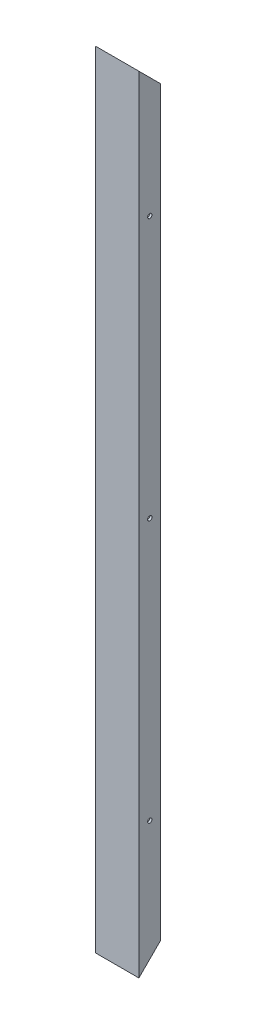
ISO-10303-21;
HEADER;
FILE_DESCRIPTION(('STEP AP214'),'2;1');
FILE_NAME('part.step','',(''),(''),'','','');
FILE_SCHEMA(('AUTOMOTIVE_DESIGN { 1 0 10303 214 1 1 1 1 }'));
ENDSEC;
DATA;
#1=APPLICATION_CONTEXT('core data for automotive mechanical design processes');
#2=APPLICATION_PROTOCOL_DEFINITION('international standard','automotive_design',2000,#1);
#3=PRODUCT_CONTEXT('',#1,'mechanical');
#4=PRODUCT('Part','Part','',(#3));
#5=PRODUCT_RELATED_PRODUCT_CATEGORY('part','',(#4));
#6=PRODUCT_DEFINITION_FORMATION('','',#4);
#7=PRODUCT_DEFINITION_CONTEXT('part definition',#1,'design');
#8=PRODUCT_DEFINITION('design','',#6,#7);
#9=PRODUCT_DEFINITION_SHAPE('','',#8);
#10=(LENGTH_UNIT() NAMED_UNIT(*) SI_UNIT(.MILLI.,.METRE.));
#11=(NAMED_UNIT(*) PLANE_ANGLE_UNIT() SI_UNIT($,.RADIAN.));
#12=(NAMED_UNIT(*) SI_UNIT($,.STERADIAN.) SOLID_ANGLE_UNIT());
#13=UNCERTAINTY_MEASURE_WITH_UNIT(LENGTH_MEASURE(1.E-05),#10,'distance_accuracy_value','');
#14=(GEOMETRIC_REPRESENTATION_CONTEXT(3) GLOBAL_UNCERTAINTY_ASSIGNED_CONTEXT((#13)) GLOBAL_UNIT_ASSIGNED_CONTEXT((#10,
#11,#12)) REPRESENTATION_CONTEXT('',''));
#15=CARTESIAN_POINT('',(0.,0.,0.));
#16=DIRECTION('',(0.,0.,1.));
#17=DIRECTION('',(1.,0.,0.));
#18=AXIS2_PLACEMENT_3D('',#15,#16,#17);
#19=CARTESIAN_POINT('',(-100.,0.,0.));
#20=DIRECTION('',(0.,0.,1.));
#21=DIRECTION('',(1.,0.,0.));
#22=AXIS2_PLACEMENT_3D('',#19,#20,#21);
#23=PLANE('',#22);
#24=DIRECTION('',(-1.,0.,0.));
#25=VECTOR('',#24,1.);
#26=CARTESIAN_POINT('',(0.,0.,0.));
#27=LINE('',#26,#25);
#28=CARTESIAN_POINT('',(0.,0.,0.));
#29=VERTEX_POINT('',#28);
#30=CARTESIAN_POINT('',(-100.,0.,0.));
#31=VERTEX_POINT('',#30);
#32=EDGE_CURVE('E172',#29,#31,#27,.T.);
#33=ORIENTED_EDGE('',*,*,#32,.F.);
#34=DIRECTION('',(0.,1.,0.));
#35=VECTOR('',#34,1.);
#36=CARTESIAN_POINT('',(0.,0.,0.));
#37=LINE('',#36,#35);
#38=CARTESIAN_POINT('',(0.,1800.,0.));
#39=VERTEX_POINT('',#38);
#40=EDGE_CURVE('E157',#29,#39,#37,.T.);
#41=ORIENTED_EDGE('',*,*,#40,.T.);
#42=DIRECTION('',(1.,0.,0.));
#43=VECTOR('',#42,1.);
#44=CARTESIAN_POINT('',(0.,1800.,0.));
#45=LINE('',#44,#43);
#46=CARTESIAN_POINT('',(-100.,1800.,0.));
#47=VERTEX_POINT('',#46);
#48=EDGE_CURVE('E20',#47,#39,#45,.T.);
#49=ORIENTED_EDGE('',*,*,#48,.F.);
#50=DIRECTION('',(0.,1.,0.));
#51=VECTOR('',#50,1.);
#52=CARTESIAN_POINT('',(-100.,0.,0.));
#53=LINE('',#52,#51);
#54=EDGE_CURVE('E173',#31,#47,#53,.T.);
#55=ORIENTED_EDGE('',*,*,#54,.F.);
#56=EDGE_LOOP('',(#33,#41,#49,#55));
#57=FACE_BOUND('',#56,.T.);
#58=ADVANCED_FACE('F17',(#57),#23,.T.);
#59=CARTESIAN_POINT('',(-5.,0.,-5.));
#60=DIRECTION('',(0.,0.,-1.));
#61=DIRECTION('',(0.,-1.,0.));
#62=AXIS2_PLACEMENT_3D('',#59,#60,#61);
#63=PLANE('',#62);
#64=DIRECTION('',(1.,0.,0.));
#65=VECTOR('',#64,1.);
#66=CARTESIAN_POINT('',(-2.5,1795.,-4.99999999999993));
#67=LINE('',#66,#65);
#68=CARTESIAN_POINT('',(-95.,1795.,-5.));
#69=VERTEX_POINT('',#68);
#70=CARTESIAN_POINT('',(-5.,1795.,-5.));
#71=VERTEX_POINT('',#70);
#72=EDGE_CURVE('E200',#69,#71,#67,.T.);
#73=ORIENTED_EDGE('',*,*,#72,.T.);
#74=DIRECTION('',(0.,1.,0.));
#75=VECTOR('',#74,1.);
#76=CARTESIAN_POINT('',(-5.,0.,-5.));
#77=LINE('',#76,#75);
#78=CARTESIAN_POINT('',(-5.,5.,-5.));
#79=VERTEX_POINT('',#78);
#80=EDGE_CURVE('E225',#79,#71,#77,.T.);
#81=ORIENTED_EDGE('',*,*,#80,.F.);
#82=DIRECTION('',(-1.,0.,0.));
#83=VECTOR('',#82,1.);
#84=CARTESIAN_POINT('',(-2.5,5.,-5.));
#85=LINE('',#84,#83);
#86=CARTESIAN_POINT('',(-95.,5.,-5.));
#87=VERTEX_POINT('',#86);
#88=EDGE_CURVE('E220',#79,#87,#85,.T.);
#89=ORIENTED_EDGE('',*,*,#88,.T.);
#90=DIRECTION('',(0.,1.,0.));
#91=VECTOR('',#90,1.);
#92=CARTESIAN_POINT('',(-95.,0.,-5.));
#93=LINE('',#92,#91);
#94=EDGE_CURVE('E11',#87,#69,#93,.T.);
#95=ORIENTED_EDGE('',*,*,#94,.T.);
#96=EDGE_LOOP('',(#73,#81,#89,#95));
#97=FACE_BOUND('',#96,.T.);
#98=ADVANCED_FACE('F356',(#97),#63,.T.);
#99=CARTESIAN_POINT('',(-95.,0.,-5.));
#100=DIRECTION('',(1.,0.,0.));
#101=DIRECTION('',(0.,1.,0.));
#102=AXIS2_PLACEMENT_3D('',#99,#100,#101);
#103=PLANE('',#102);
#104=CARTESIAN_POINT('',(-95.,1500.,-25.));
#105=DIRECTION('',(-1.,0.,0.));
#106=DIRECTION('',(0.,0.,1.));
#107=AXIS2_PLACEMENT_3D('',#104,#105,#106);
#108=CIRCLE('',#107,5.);
#109=CARTESIAN_POINT('',(-95.,1500.,-30.));
#110=VERTEX_POINT('',#109);
#111=EDGE_CURVE('E230',#110,#110,#108,.T.);
#112=ORIENTED_EDGE('',*,*,#111,.T.);
#113=EDGE_LOOP('',(#112));
#114=FACE_BOUND('',#113,.T.);
#115=CARTESIAN_POINT('',(-95.,300.,-25.));
#116=DIRECTION('',(-1.,0.,0.));
#117=DIRECTION('',(0.,0.,1.));
#118=AXIS2_PLACEMENT_3D('',#115,#116,#117);
#119=CIRCLE('',#118,5.);
#120=CARTESIAN_POINT('',(-95.,300.,-30.));
#121=VERTEX_POINT('',#120);
#122=EDGE_CURVE('E202',#121,#121,#119,.T.);
#123=ORIENTED_EDGE('',*,*,#122,.T.);
#124=EDGE_LOOP('',(#123));
#125=FACE_BOUND('',#124,.T.);
#126=CARTESIAN_POINT('',(-95.,900.,-25.));
#127=DIRECTION('',(-1.,0.,0.));
#128=DIRECTION('',(0.,0.,1.));
#129=AXIS2_PLACEMENT_3D('',#126,#127,#128);
#130=CIRCLE('',#129,5.);
#131=CARTESIAN_POINT('',(-95.,900.,-30.));
#132=VERTEX_POINT('',#131);
#133=EDGE_CURVE('E251',#132,#132,#130,.T.);
#134=ORIENTED_EDGE('',*,*,#133,.T.);
#135=EDGE_LOOP('',(#134));
#136=FACE_BOUND('',#135,.T.);
#137=DIRECTION('',(0.,0.707106781186547,0.707106781186548));
#138=VECTOR('',#137,1.);
#139=CARTESIAN_POINT('',(-95.,1323.75,-476.25));
#140=LINE('',#139,#138);
#141=CARTESIAN_POINT('',(-95.,1750.,-50.));
#142=VERTEX_POINT('',#141);
#143=EDGE_CURVE('E216',#142,#69,#140,.T.);
#144=ORIENTED_EDGE('',*,*,#143,.T.);
#145=ORIENTED_EDGE('',*,*,#94,.F.);
#146=DIRECTION('',(0.,0.707106781186548,-0.707106781186548));
#147=VECTOR('',#146,1.);
#148=CARTESIAN_POINT('',(-95.,1.25,-1.25));
#149=LINE('',#148,#147);
#150=CARTESIAN_POINT('',(-95.,50.,-50.));
#151=VERTEX_POINT('',#150);
#152=EDGE_CURVE('E224',#87,#151,#149,.T.);
#153=ORIENTED_EDGE('',*,*,#152,.T.);
#154=DIRECTION('',(0.,1.,0.));
#155=VECTOR('',#154,1.);
#156=CARTESIAN_POINT('',(-95.,0.,-50.));
#157=LINE('',#156,#155);
#158=EDGE_CURVE('E27',#151,#142,#157,.T.);
#159=ORIENTED_EDGE('',*,*,#158,.T.);
#160=EDGE_LOOP('',(#144,#145,#153,#159));
#161=FACE_BOUND('',#160,.T.);
#162=ADVANCED_FACE('F330',(#114,#125,#136,#161),#103,.T.);
#163=CARTESIAN_POINT('',(-95.,0.,-50.));
#164=DIRECTION('',(0.,0.,-1.));
#165=DIRECTION('',(0.,-1.,0.));
#166=AXIS2_PLACEMENT_3D('',#163,#164,#165);
#167=PLANE('',#166);
#168=DIRECTION('',(1.,0.,0.));
#169=VECTOR('',#168,1.);
#170=CARTESIAN_POINT('',(-47.5,1750.,-50.));
#171=LINE('',#170,#169);
#172=CARTESIAN_POINT('',(-100.,1750.,-50.));
#173=VERTEX_POINT('',#172);
#174=EDGE_CURVE('E215',#173,#142,#171,.T.);
#175=ORIENTED_EDGE('',*,*,#174,.T.);
#176=ORIENTED_EDGE('',*,*,#158,.F.);
#177=DIRECTION('',(-1.,0.,0.));
#178=VECTOR('',#177,1.);
#179=CARTESIAN_POINT('',(-47.5,50.,-50.));
#180=LINE('',#179,#178);
#181=CARTESIAN_POINT('',(-100.,50.,-50.));
#182=VERTEX_POINT('',#181);
#183=EDGE_CURVE('E263',#151,#182,#180,.T.);
#184=ORIENTED_EDGE('',*,*,#183,.T.);
#185=DIRECTION('',(0.,1.,0.));
#186=VECTOR('',#185,1.);
#187=CARTESIAN_POINT('',(-100.,0.,-50.));
#188=LINE('',#187,#186);
#189=EDGE_CURVE('E41',#182,#173,#188,.T.);
#190=ORIENTED_EDGE('',*,*,#189,.T.);
#191=EDGE_LOOP('',(#175,#176,#184,#190));
#192=FACE_BOUND('',#191,.T.);
#193=ADVANCED_FACE('F321',(#192),#167,.T.);
#194=CARTESIAN_POINT('',(-100.,0.,-50.));
#195=DIRECTION('',(-1.,0.,0.));
#196=DIRECTION('',(0.,0.,1.));
#197=AXIS2_PLACEMENT_3D('',#194,#195,#196);
#198=PLANE('',#197);
#199=CARTESIAN_POINT('',(-100.,1500.,-25.));
#200=DIRECTION('',(1.,0.,0.));
#201=DIRECTION('',(0.,0.,1.));
#202=AXIS2_PLACEMENT_3D('',#199,#200,#201);
#203=CIRCLE('',#202,5.);
#204=CARTESIAN_POINT('',(-100.,1500.,-30.));
#205=VERTEX_POINT('',#204);
#206=EDGE_CURVE('E208',#205,#205,#203,.T.);
#207=ORIENTED_EDGE('',*,*,#206,.T.);
#208=EDGE_LOOP('',(#207));
#209=FACE_BOUND('',#208,.T.);
#210=CARTESIAN_POINT('',(-100.,300.,-25.));
#211=DIRECTION('',(1.,0.,0.));
#212=DIRECTION('',(0.,0.,1.));
#213=AXIS2_PLACEMENT_3D('',#210,#211,#212);
#214=CIRCLE('',#213,5.);
#215=CARTESIAN_POINT('',(-100.,300.,-30.));
#216=VERTEX_POINT('',#215);
#217=EDGE_CURVE('E128',#216,#216,#214,.T.);
#218=ORIENTED_EDGE('',*,*,#217,.T.);
#219=EDGE_LOOP('',(#218));
#220=FACE_BOUND('',#219,.T.);
#221=CARTESIAN_POINT('',(-100.,900.,-25.));
#222=DIRECTION('',(1.,0.,0.));
#223=DIRECTION('',(0.,0.,1.));
#224=AXIS2_PLACEMENT_3D('',#221,#222,#223);
#225=CIRCLE('',#224,5.);
#226=CARTESIAN_POINT('',(-100.,900.,-30.));
#227=VERTEX_POINT('',#226);
#228=EDGE_CURVE('E294',#227,#227,#225,.T.);
#229=ORIENTED_EDGE('',*,*,#228,.T.);
#230=EDGE_LOOP('',(#229));
#231=FACE_BOUND('',#230,.T.);
#232=DIRECTION('',(0.,-0.707106781186547,-0.707106781186548));
#233=VECTOR('',#232,1.);
#234=CARTESIAN_POINT('',(-100.,1312.5,-487.5));
#235=LINE('',#234,#233);
#236=EDGE_CURVE('E212',#47,#173,#235,.T.);
#237=ORIENTED_EDGE('',*,*,#236,.T.);
#238=ORIENTED_EDGE('',*,*,#189,.F.);
#239=DIRECTION('',(0.,-0.707106781186548,0.707106781186548));
#240=VECTOR('',#239,1.);
#241=CARTESIAN_POINT('',(-100.,12.5,-12.5));
#242=LINE('',#241,#240);
#243=EDGE_CURVE('E177',#182,#31,#242,.T.);
#244=ORIENTED_EDGE('',*,*,#243,.T.);
#245=ORIENTED_EDGE('',*,*,#54,.T.);
#246=EDGE_LOOP('',(#237,#238,#244,#245));
#247=FACE_BOUND('',#246,.T.);
#248=ADVANCED_FACE('F285',(#209,#220,#231,#247),#198,.T.);
#249=CARTESIAN_POINT('',(0.,0.,0.));
#250=DIRECTION('',(1.,0.,0.));
#251=DIRECTION('',(0.,1.,0.));
#252=AXIS2_PLACEMENT_3D('',#249,#250,#251);
#253=PLANE('',#252);
#254=CARTESIAN_POINT('',(0.,1500.,-25.));
#255=DIRECTION('',(-1.,0.,0.));
#256=DIRECTION('',(0.,0.,1.));
#257=AXIS2_PLACEMENT_3D('',#254,#255,#256);
#258=CIRCLE('',#257,5.);
#259=CARTESIAN_POINT('',(0.,1500.,-30.));
#260=VERTEX_POINT('',#259);
#261=EDGE_CURVE('E211',#260,#260,#258,.T.);
#262=ORIENTED_EDGE('',*,*,#261,.T.);
#263=EDGE_LOOP('',(#262));
#264=FACE_BOUND('',#263,.T.);
#265=CARTESIAN_POINT('',(0.,300.,-25.));
#266=DIRECTION('',(-1.,0.,0.));
#267=DIRECTION('',(0.,0.,1.));
#268=AXIS2_PLACEMENT_3D('',#265,#266,#267);
#269=CIRCLE('',#268,5.);
#270=CARTESIAN_POINT('',(0.,300.,-30.));
#271=VERTEX_POINT('',#270);
#272=EDGE_CURVE('E238',#271,#271,#269,.T.);
#273=ORIENTED_EDGE('',*,*,#272,.T.);
#274=EDGE_LOOP('',(#273));
#275=FACE_BOUND('',#274,.T.);
#276=CARTESIAN_POINT('',(0.,900.,-25.));
#277=DIRECTION('',(-1.,0.,0.));
#278=DIRECTION('',(0.,0.,1.));
#279=AXIS2_PLACEMENT_3D('',#276,#277,#278);
#280=CIRCLE('',#279,5.);
#281=CARTESIAN_POINT('',(0.,900.,-30.));
#282=VERTEX_POINT('',#281);
#283=EDGE_CURVE('E290',#282,#282,#280,.T.);
#284=ORIENTED_EDGE('',*,*,#283,.T.);
#285=EDGE_LOOP('',(#284));
#286=FACE_BOUND('',#285,.T.);
#287=DIRECTION('',(0.,0.707106781186547,0.707106781186548));
#288=VECTOR('',#287,1.);
#289=CARTESIAN_POINT('',(0.,1325.,-475.));
#290=LINE('',#289,#288);
#291=CARTESIAN_POINT('',(0.,1750.,-50.));
#292=VERTEX_POINT('',#291);
#293=EDGE_CURVE('E164',#292,#39,#290,.T.);
#294=ORIENTED_EDGE('',*,*,#293,.T.);
#295=ORIENTED_EDGE('',*,*,#40,.F.);
#296=DIRECTION('',(0.,0.707106781186548,-0.707106781186548));
#297=VECTOR('',#296,1.);
#298=CARTESIAN_POINT('',(0.,0.,0.));
#299=LINE('',#298,#297);
#300=CARTESIAN_POINT('',(0.,50.,-50.));
#301=VERTEX_POINT('',#300);
#302=EDGE_CURVE('E161',#29,#301,#299,.T.);
#303=ORIENTED_EDGE('',*,*,#302,.T.);
#304=DIRECTION('',(0.,1.,0.));
#305=VECTOR('',#304,1.);
#306=CARTESIAN_POINT('',(0.,0.,-50.));
#307=LINE('',#306,#305);
#308=EDGE_CURVE('E169',#301,#292,#307,.T.);
#309=ORIENTED_EDGE('',*,*,#308,.T.);
#310=EDGE_LOOP('',(#294,#295,#303,#309));
#311=FACE_BOUND('',#310,.T.);
#312=ADVANCED_FACE('F159',(#264,#275,#286,#311),#253,.T.);
#313=CARTESIAN_POINT('',(0.,0.,-50.));
#314=DIRECTION('',(0.,0.,-1.));
#315=DIRECTION('',(0.,-1.,0.));
#316=AXIS2_PLACEMENT_3D('',#313,#314,#315);
#317=PLANE('',#316);
#318=DIRECTION('',(1.,0.,0.));
#319=VECTOR('',#318,1.);
#320=CARTESIAN_POINT('',(0.,1750.,-50.));
#321=LINE('',#320,#319);
#322=CARTESIAN_POINT('',(-5.,1750.,-50.));
#323=VERTEX_POINT('',#322);
#324=EDGE_CURVE('E334',#323,#292,#321,.T.);
#325=ORIENTED_EDGE('',*,*,#324,.T.);
#326=ORIENTED_EDGE('',*,*,#308,.F.);
#327=DIRECTION('',(-1.,0.,0.));
#328=VECTOR('',#327,1.);
#329=CARTESIAN_POINT('',(0.,50.,-50.));
#330=LINE('',#329,#328);
#331=CARTESIAN_POINT('',(-5.,50.,-50.));
#332=VERTEX_POINT('',#331);
#333=EDGE_CURVE('E183',#301,#332,#330,.T.);
#334=ORIENTED_EDGE('',*,*,#333,.T.);
#335=DIRECTION('',(0.,1.,0.));
#336=VECTOR('',#335,1.);
#337=CARTESIAN_POINT('',(-5.,0.,-50.));
#338=LINE('',#337,#336);
#339=EDGE_CURVE('E227',#332,#323,#338,.T.);
#340=ORIENTED_EDGE('',*,*,#339,.T.);
#341=EDGE_LOOP('',(#325,#326,#334,#340));
#342=FACE_BOUND('',#341,.T.);
#343=ADVANCED_FACE('F284',(#342),#317,.T.);
#344=CARTESIAN_POINT('',(-5.,0.,-50.));
#345=DIRECTION('',(-1.,0.,0.));
#346=DIRECTION('',(0.,0.,1.));
#347=AXIS2_PLACEMENT_3D('',#344,#345,#346);
#348=PLANE('',#347);
#349=CARTESIAN_POINT('',(-5.,1500.,-25.));
#350=DIRECTION('',(1.,0.,0.));
#351=DIRECTION('',(0.,0.,1.));
#352=AXIS2_PLACEMENT_3D('',#349,#350,#351);
#353=CIRCLE('',#352,5.);
#354=CARTESIAN_POINT('',(-5.,1500.,-30.));
#355=VERTEX_POINT('',#354);
#356=EDGE_CURVE('E201',#355,#355,#353,.T.);
#357=ORIENTED_EDGE('',*,*,#356,.T.);
#358=EDGE_LOOP('',(#357));
#359=FACE_BOUND('',#358,.T.);
#360=CARTESIAN_POINT('',(-5.,300.,-25.));
#361=DIRECTION('',(1.,0.,0.));
#362=DIRECTION('',(0.,0.,1.));
#363=AXIS2_PLACEMENT_3D('',#360,#361,#362);
#364=CIRCLE('',#363,5.);
#365=CARTESIAN_POINT('',(-5.,300.,-30.));
#366=VERTEX_POINT('',#365);
#367=EDGE_CURVE('E228',#366,#366,#364,.T.);
#368=ORIENTED_EDGE('',*,*,#367,.T.);
#369=EDGE_LOOP('',(#368));
#370=FACE_BOUND('',#369,.T.);
#371=CARTESIAN_POINT('',(-5.,900.,-25.));
#372=DIRECTION('',(1.,0.,0.));
#373=DIRECTION('',(0.,0.,1.));
#374=AXIS2_PLACEMENT_3D('',#371,#372,#373);
#375=CIRCLE('',#374,5.);
#376=CARTESIAN_POINT('',(-5.,900.,-30.));
#377=VERTEX_POINT('',#376);
#378=EDGE_CURVE('E207',#377,#377,#375,.T.);
#379=ORIENTED_EDGE('',*,*,#378,.T.);
#380=EDGE_LOOP('',(#379));
#381=FACE_BOUND('',#380,.T.);
#382=DIRECTION('',(0.,-0.707106781186547,-0.707106781186548));
#383=VECTOR('',#382,1.);
#384=CARTESIAN_POINT('',(-4.99999999999987,1312.5,-487.5));
#385=LINE('',#384,#383);
#386=EDGE_CURVE('E196',#71,#323,#385,.T.);
#387=ORIENTED_EDGE('',*,*,#386,.T.);
#388=ORIENTED_EDGE('',*,*,#339,.F.);
#389=DIRECTION('',(0.,-0.707106781186548,0.707106781186548));
#390=VECTOR('',#389,1.);
#391=CARTESIAN_POINT('',(-5.,12.5,-12.5));
#392=LINE('',#391,#390);
#393=EDGE_CURVE('E190',#332,#79,#392,.T.);
#394=ORIENTED_EDGE('',*,*,#393,.T.);
#395=ORIENTED_EDGE('',*,*,#80,.T.);
#396=EDGE_LOOP('',(#387,#388,#394,#395));
#397=FACE_BOUND('',#396,.T.);
#398=ADVANCED_FACE('F277',(#359,#370,#381,#397),#348,.T.);
#399=CARTESIAN_POINT('',(0.,0.,0.));
#400=DIRECTION('',(0.,0.707106781186548,0.707106781186548));
#401=DIRECTION('',(1.,0.,0.));
#402=AXIS2_PLACEMENT_3D('',#399,#400,#401);
#403=PLANE('',#402);
#404=ORIENTED_EDGE('',*,*,#152,.F.);
#405=ORIENTED_EDGE('',*,*,#88,.F.);
#406=ORIENTED_EDGE('',*,*,#393,.F.);
#407=ORIENTED_EDGE('',*,*,#333,.F.);
#408=ORIENTED_EDGE('',*,*,#302,.F.);
#409=ORIENTED_EDGE('',*,*,#32,.T.);
#410=ORIENTED_EDGE('',*,*,#243,.F.);
#411=ORIENTED_EDGE('',*,*,#183,.F.);
#412=EDGE_LOOP('',(#404,#405,#406,#407,#408,#409,#410,#411));
#413=FACE_BOUND('',#412,.T.);
#414=ADVANCED_FACE('F180',(#413),#403,.F.);
#415=CARTESIAN_POINT('',(0.,1750.,-50.));
#416=DIRECTION('',(0.,-0.707106781186548,0.707106781186547));
#417=DIRECTION('',(-1.,0.,0.));
#418=AXIS2_PLACEMENT_3D('',#415,#416,#417);
#419=PLANE('',#418);
#420=ORIENTED_EDGE('',*,*,#386,.F.);
#421=ORIENTED_EDGE('',*,*,#72,.F.);
#422=ORIENTED_EDGE('',*,*,#143,.F.);
#423=ORIENTED_EDGE('',*,*,#174,.F.);
#424=ORIENTED_EDGE('',*,*,#236,.F.);
#425=ORIENTED_EDGE('',*,*,#48,.T.);
#426=ORIENTED_EDGE('',*,*,#293,.F.);
#427=ORIENTED_EDGE('',*,*,#324,.F.);
#428=EDGE_LOOP('',(#420,#421,#422,#423,#424,#425,#426,#427));
#429=FACE_BOUND('',#428,.T.);
#430=ADVANCED_FACE('F327',(#429),#419,.F.);
#431=CARTESIAN_POINT('',(0.,1500.,-25.));
#432=DIRECTION('',(-1.,0.,0.));
#433=DIRECTION('',(0.,0.,1.));
#434=AXIS2_PLACEMENT_3D('',#431,#432,#433);
#435=CYLINDRICAL_SURFACE('',#434,5.);
#436=ORIENTED_EDGE('',*,*,#261,.F.);
#437=DIRECTION('',(-1.,0.,0.));
#438=VECTOR('',#437,1.);
#439=CARTESIAN_POINT('',(0.,1500.,-30.));
#440=LINE('',#439,#438);
#441=EDGE_CURVE('E256',#260,#355,#440,.T.);
#442=ORIENTED_EDGE('',*,*,#441,.T.);
#443=ORIENTED_EDGE('',*,*,#356,.F.);
#444=ORIENTED_EDGE('',*,*,#441,.F.);
#445=EDGE_LOOP('',(#436,#442,#443,#444));
#446=FACE_BOUND('',#445,.T.);
#447=ADVANCED_FACE('F280',(#446),#435,.F.);
#448=CARTESIAN_POINT('',(0.,1500.,-25.));
#449=DIRECTION('',(-1.,0.,0.));
#450=DIRECTION('',(0.,0.,1.));
#451=AXIS2_PLACEMENT_3D('',#448,#449,#450);
#452=CYLINDRICAL_SURFACE('',#451,5.);
#453=ORIENTED_EDGE('',*,*,#111,.F.);
#454=DIRECTION('',(-1.,0.,0.));
#455=VECTOR('',#454,1.);
#456=CARTESIAN_POINT('',(0.,1500.,-30.));
#457=LINE('',#456,#455);
#458=EDGE_CURVE('E194',#110,#205,#457,.T.);
#459=ORIENTED_EDGE('',*,*,#458,.T.);
#460=ORIENTED_EDGE('',*,*,#206,.F.);
#461=ORIENTED_EDGE('',*,*,#458,.F.);
#462=EDGE_LOOP('',(#453,#459,#460,#461));
#463=FACE_BOUND('',#462,.T.);
#464=ADVANCED_FACE('F382',(#463),#452,.F.);
#465=CARTESIAN_POINT('',(0.,300.,-25.));
#466=DIRECTION('',(-1.,0.,0.));
#467=DIRECTION('',(0.,0.,1.));
#468=AXIS2_PLACEMENT_3D('',#465,#466,#467);
#469=CYLINDRICAL_SURFACE('',#468,5.);
#470=ORIENTED_EDGE('',*,*,#272,.F.);
#471=DIRECTION('',(-1.,0.,0.));
#472=VECTOR('',#471,1.);
#473=CARTESIAN_POINT('',(0.,300.,-30.));
#474=LINE('',#473,#472);
#475=EDGE_CURVE('E118',#271,#366,#474,.T.);
#476=ORIENTED_EDGE('',*,*,#475,.T.);
#477=ORIENTED_EDGE('',*,*,#367,.F.);
#478=ORIENTED_EDGE('',*,*,#475,.F.);
#479=EDGE_LOOP('',(#470,#476,#477,#478));
#480=FACE_BOUND('',#479,.T.);
#481=ADVANCED_FACE('F387',(#480),#469,.F.);
#482=CARTESIAN_POINT('',(0.,300.,-25.));
#483=DIRECTION('',(-1.,0.,0.));
#484=DIRECTION('',(0.,0.,1.));
#485=AXIS2_PLACEMENT_3D('',#482,#483,#484);
#486=CYLINDRICAL_SURFACE('',#485,5.);
#487=ORIENTED_EDGE('',*,*,#122,.F.);
#488=DIRECTION('',(-1.,0.,0.));
#489=VECTOR('',#488,1.);
#490=CARTESIAN_POINT('',(0.,300.,-30.));
#491=LINE('',#490,#489);
#492=EDGE_CURVE('E206',#121,#216,#491,.T.);
#493=ORIENTED_EDGE('',*,*,#492,.T.);
#494=ORIENTED_EDGE('',*,*,#217,.F.);
#495=ORIENTED_EDGE('',*,*,#492,.F.);
#496=EDGE_LOOP('',(#487,#493,#494,#495));
#497=FACE_BOUND('',#496,.T.);
#498=ADVANCED_FACE('F397',(#497),#486,.F.);
#499=CARTESIAN_POINT('',(0.,900.,-25.));
#500=DIRECTION('',(-1.,0.,0.));
#501=DIRECTION('',(0.,0.,1.));
#502=AXIS2_PLACEMENT_3D('',#499,#500,#501);
#503=CYLINDRICAL_SURFACE('',#502,5.);
#504=ORIENTED_EDGE('',*,*,#283,.F.);
#505=DIRECTION('',(-1.,0.,0.));
#506=VECTOR('',#505,1.);
#507=CARTESIAN_POINT('',(0.,900.,-30.));
#508=LINE('',#507,#506);
#509=EDGE_CURVE('E270',#282,#377,#508,.T.);
#510=ORIENTED_EDGE('',*,*,#509,.T.);
#511=ORIENTED_EDGE('',*,*,#378,.F.);
#512=ORIENTED_EDGE('',*,*,#509,.F.);
#513=EDGE_LOOP('',(#504,#510,#511,#512));
#514=FACE_BOUND('',#513,.T.);
#515=ADVANCED_FACE('F399',(#514),#503,.F.);
#516=CARTESIAN_POINT('',(0.,900.,-25.));
#517=DIRECTION('',(-1.,0.,0.));
#518=DIRECTION('',(0.,0.,1.));
#519=AXIS2_PLACEMENT_3D('',#516,#517,#518);
#520=CYLINDRICAL_SURFACE('',#519,5.);
#521=ORIENTED_EDGE('',*,*,#133,.F.);
#522=DIRECTION('',(-1.,0.,0.));
#523=VECTOR('',#522,1.);
#524=CARTESIAN_POINT('',(0.,900.,-30.));
#525=LINE('',#524,#523);
#526=EDGE_CURVE('E255',#132,#227,#525,.T.);
#527=ORIENTED_EDGE('',*,*,#526,.T.);
#528=ORIENTED_EDGE('',*,*,#228,.F.);
#529=ORIENTED_EDGE('',*,*,#526,.F.);
#530=EDGE_LOOP('',(#521,#527,#528,#529));
#531=FACE_BOUND('',#530,.T.);
#532=ADVANCED_FACE('F402',(#531),#520,.F.);
#533=CLOSED_SHELL('',(#58,#98,#162,#193,#248,#312,#343,#398,#414,#430,#447,#464,#481,#498,#515,#532));
#534=MANIFOLD_SOLID_BREP('B1',#533);
#535=ADVANCED_BREP_SHAPE_REPRESENTATION('',(#18,#534),#14);
#536=SHAPE_DEFINITION_REPRESENTATION(#9,#535);
ENDSEC;
END-ISO-10303-21;
